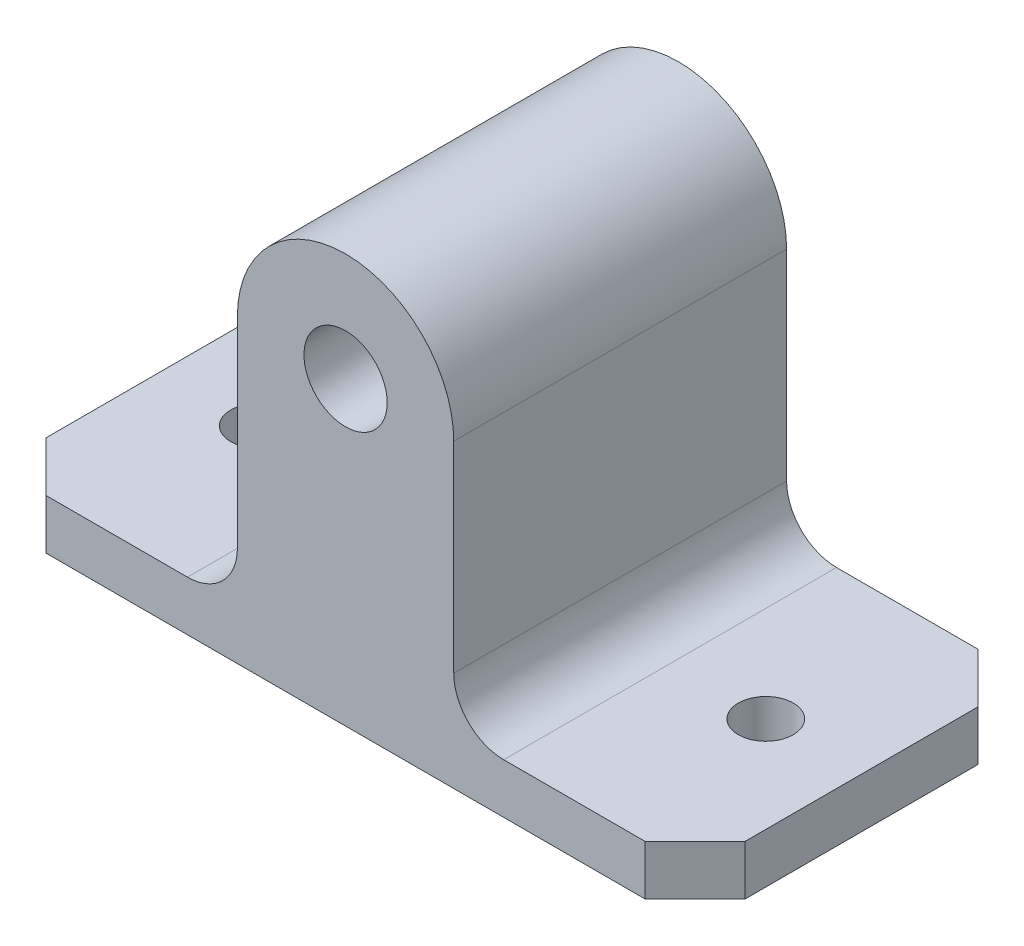
ISO-10303-21;
HEADER;
FILE_DESCRIPTION(('STEP AP214'),'2;1');
FILE_NAME('part.step','',(''),(''),'','','');
FILE_SCHEMA(('AUTOMOTIVE_DESIGN { 1 0 10303 214 1 1 1 1 }'));
ENDSEC;
DATA;
#1=APPLICATION_CONTEXT('core data for automotive mechanical design processes');
#2=APPLICATION_PROTOCOL_DEFINITION('international standard','automotive_design',2000,#1);
#3=PRODUCT_CONTEXT('',#1,'mechanical');
#4=PRODUCT('Part','Part','',(#3));
#5=PRODUCT_RELATED_PRODUCT_CATEGORY('part','',(#4));
#6=PRODUCT_DEFINITION_FORMATION('','',#4);
#7=PRODUCT_DEFINITION_CONTEXT('part definition',#1,'design');
#8=PRODUCT_DEFINITION('design','',#6,#7);
#9=PRODUCT_DEFINITION_SHAPE('','',#8);
#10=(LENGTH_UNIT() NAMED_UNIT(*) SI_UNIT(.MILLI.,.METRE.));
#11=(NAMED_UNIT(*) PLANE_ANGLE_UNIT() SI_UNIT($,.RADIAN.));
#12=(NAMED_UNIT(*) SI_UNIT($,.STERADIAN.) SOLID_ANGLE_UNIT());
#13=UNCERTAINTY_MEASURE_WITH_UNIT(LENGTH_MEASURE(1.E-05),#10,'distance_accuracy_value','');
#14=(GEOMETRIC_REPRESENTATION_CONTEXT(3) GLOBAL_UNCERTAINTY_ASSIGNED_CONTEXT((#13)) GLOBAL_UNIT_ASSIGNED_CONTEXT((#10,
#11,#12)) REPRESENTATION_CONTEXT('',''));
#15=CARTESIAN_POINT('',(0.,0.,0.));
#16=DIRECTION('',(0.,0.,1.));
#17=DIRECTION('',(1.,0.,0.));
#18=AXIS2_PLACEMENT_3D('',#15,#16,#17);
#19=CARTESIAN_POINT('',(-9.5,-12.0723673279713,20.));
#20=DIRECTION('',(0.,0.,-1.));
#21=DIRECTION('',(-1.,0.,0.));
#22=AXIS2_PLACEMENT_3D('',#19,#20,#21);
#23=PLANE('',#22);
#24=DIRECTION('',(-1.,0.,0.));
#25=VECTOR('',#24,1.);
#26=CARTESIAN_POINT('',(-21.,-15.0723673279713,20.));
#27=LINE('',#26,#25);
#28=CARTESIAN_POINT('',(-9.5,-15.0723673279713,20.));
#29=VERTEX_POINT('',#28);
#30=CARTESIAN_POINT('',(-18.,-15.0723673279713,20.));
#31=VERTEX_POINT('',#30);
#32=EDGE_CURVE('E185',#29,#31,#27,.T.);
#33=ORIENTED_EDGE('',*,*,#32,.T.);
#34=DIRECTION('',(0.,-1.,0.));
#35=VECTOR('',#34,1.);
#36=CARTESIAN_POINT('',(-18.,-12.0723673279713,20.));
#37=LINE('',#36,#35);
#38=CARTESIAN_POINT('',(-18.,-18.0723673279713,20.));
#39=VERTEX_POINT('',#38);
#40=EDGE_CURVE('E248',#31,#39,#37,.T.);
#41=ORIENTED_EDGE('',*,*,#40,.T.);
#42=DIRECTION('',(1.,0.,0.));
#43=VECTOR('',#42,1.);
#44=CARTESIAN_POINT('',(-21.,-18.0723673279713,20.));
#45=LINE('',#44,#43);
#46=CARTESIAN_POINT('',(18.,-18.0723673279713,20.));
#47=VERTEX_POINT('',#46);
#48=EDGE_CURVE('E153',#39,#47,#45,.T.);
#49=ORIENTED_EDGE('',*,*,#48,.T.);
#50=DIRECTION('',(0.,1.,0.));
#51=VECTOR('',#50,1.);
#52=CARTESIAN_POINT('',(18.,-12.0723673279713,20.));
#53=LINE('',#52,#51);
#54=CARTESIAN_POINT('',(18.,-15.0723673279713,20.));
#55=VERTEX_POINT('',#54);
#56=EDGE_CURVE('E151',#47,#55,#53,.T.);
#57=ORIENTED_EDGE('',*,*,#56,.T.);
#58=DIRECTION('',(-1.,0.,0.));
#59=VECTOR('',#58,1.);
#60=CARTESIAN_POINT('',(9.5,-15.0723673279713,20.));
#61=LINE('',#60,#59);
#62=CARTESIAN_POINT('',(9.5,-15.0723673279713,20.));
#63=VERTEX_POINT('',#62);
#64=EDGE_CURVE('E142',#55,#63,#61,.T.);
#65=ORIENTED_EDGE('',*,*,#64,.T.);
#66=CARTESIAN_POINT('',(9.5,-12.0723673279713,20.));
#67=DIRECTION('',(0.,0.,-1.));
#68=DIRECTION('',(-1.,0.,0.));
#69=AXIS2_PLACEMENT_3D('',#66,#67,#68);
#70=CIRCLE('',#69,3.);
#71=CARTESIAN_POINT('',(6.5,-12.0723673279713,20.));
#72=VERTEX_POINT('',#71);
#73=EDGE_CURVE('E147',#63,#72,#70,.T.);
#74=ORIENTED_EDGE('',*,*,#73,.T.);
#75=DIRECTION('',(0.,1.,0.));
#76=VECTOR('',#75,1.);
#77=CARTESIAN_POINT('',(6.5,0.,20.));
#78=LINE('',#77,#76);
#79=CARTESIAN_POINT('',(6.5,0.,20.));
#80=VERTEX_POINT('',#79);
#81=EDGE_CURVE('E170',#72,#80,#78,.T.);
#82=ORIENTED_EDGE('',*,*,#81,.T.);
#83=CARTESIAN_POINT('',(0.,0.,20.));
#84=DIRECTION('',(0.,0.,1.));
#85=DIRECTION('',(1.,0.,0.));
#86=AXIS2_PLACEMENT_3D('',#83,#84,#85);
#87=CIRCLE('',#86,6.5);
#88=CARTESIAN_POINT('',(-6.5,0.,20.));
#89=VERTEX_POINT('',#88);
#90=EDGE_CURVE('E173',#80,#89,#87,.T.);
#91=ORIENTED_EDGE('',*,*,#90,.T.);
#92=DIRECTION('',(0.,-1.,0.));
#93=VECTOR('',#92,1.);
#94=CARTESIAN_POINT('',(-6.5,0.,20.));
#95=LINE('',#94,#93);
#96=CARTESIAN_POINT('',(-6.5,-12.0723673279713,20.));
#97=VERTEX_POINT('',#96);
#98=EDGE_CURVE('E179',#89,#97,#95,.T.);
#99=ORIENTED_EDGE('',*,*,#98,.T.);
#100=CARTESIAN_POINT('',(-9.5,-12.0723673279713,20.));
#101=DIRECTION('',(0.,0.,-1.));
#102=DIRECTION('',(-1.,0.,0.));
#103=AXIS2_PLACEMENT_3D('',#100,#101,#102);
#104=CIRCLE('',#103,3.);
#105=EDGE_CURVE('E182',#97,#29,#104,.T.);
#106=ORIENTED_EDGE('',*,*,#105,.T.);
#107=EDGE_LOOP('',(#33,#41,#49,#57,#65,#74,#82,#91,#99,#106));
#108=FACE_BOUND('',#107,.T.);
#109=CARTESIAN_POINT('',(0.,0.,20.));
#110=DIRECTION('',(0.,0.,1.));
#111=DIRECTION('',(1.,0.,0.));
#112=AXIS2_PLACEMENT_3D('',#109,#110,#111);
#113=CIRCLE('',#112,2.5);
#114=CARTESIAN_POINT('',(2.5,0.,20.));
#115=VERTEX_POINT('',#114);
#116=EDGE_CURVE('E193',#115,#115,#113,.T.);
#117=ORIENTED_EDGE('',*,*,#116,.F.);
#118=EDGE_LOOP('',(#117));
#119=FACE_BOUND('',#118,.T.);
#120=ADVANCED_FACE('F41',(#108,#119),#23,.F.);
#121=CARTESIAN_POINT('',(-9.5,-12.0723673279713,0.));
#122=DIRECTION('',(0.,0.,-1.));
#123=DIRECTION('',(-1.,0.,0.));
#124=AXIS2_PLACEMENT_3D('',#121,#122,#123);
#125=PLANE('',#124);
#126=DIRECTION('',(1.,0.,0.));
#127=VECTOR('',#126,1.);
#128=CARTESIAN_POINT('',(-21.,-18.0723673279713,0.));
#129=LINE('',#128,#127);
#130=CARTESIAN_POINT('',(-18.,-18.0723673279713,0.));
#131=VERTEX_POINT('',#130);
#132=CARTESIAN_POINT('',(18.,-18.0723673279713,0.));
#133=VERTEX_POINT('',#132);
#134=EDGE_CURVE('E189',#131,#133,#129,.T.);
#135=ORIENTED_EDGE('',*,*,#134,.F.);
#136=DIRECTION('',(0.,1.,0.));
#137=VECTOR('',#136,1.);
#138=CARTESIAN_POINT('',(-18.,-15.0723673279713,0.));
#139=LINE('',#138,#137);
#140=CARTESIAN_POINT('',(-18.,-15.0723673279713,0.));
#141=VERTEX_POINT('',#140);
#142=EDGE_CURVE('E280',#131,#141,#139,.T.);
#143=ORIENTED_EDGE('',*,*,#142,.T.);
#144=DIRECTION('',(-1.,0.,0.));
#145=VECTOR('',#144,1.);
#146=CARTESIAN_POINT('',(-21.,-15.0723673279713,0.));
#147=LINE('',#146,#145);
#148=CARTESIAN_POINT('',(-9.5,-15.0723673279713,0.));
#149=VERTEX_POINT('',#148);
#150=EDGE_CURVE('E211',#149,#141,#147,.T.);
#151=ORIENTED_EDGE('',*,*,#150,.F.);
#152=CARTESIAN_POINT('',(-9.5,-12.0723673279713,0.));
#153=DIRECTION('',(0.,0.,-1.));
#154=DIRECTION('',(-1.,0.,0.));
#155=AXIS2_PLACEMENT_3D('',#152,#153,#154);
#156=CIRCLE('',#155,3.);
#157=CARTESIAN_POINT('',(-6.5,-12.0723673279713,0.));
#158=VERTEX_POINT('',#157);
#159=EDGE_CURVE('E208',#158,#149,#156,.T.);
#160=ORIENTED_EDGE('',*,*,#159,.F.);
#161=DIRECTION('',(0.,-1.,0.));
#162=VECTOR('',#161,1.);
#163=CARTESIAN_POINT('',(-6.5,0.,0.));
#164=LINE('',#163,#162);
#165=CARTESIAN_POINT('',(-6.5,0.,0.));
#166=VERTEX_POINT('',#165);
#167=EDGE_CURVE('E205',#166,#158,#164,.T.);
#168=ORIENTED_EDGE('',*,*,#167,.F.);
#169=CARTESIAN_POINT('',(0.,0.,0.));
#170=DIRECTION('',(0.,0.,1.));
#171=DIRECTION('',(1.,0.,0.));
#172=AXIS2_PLACEMENT_3D('',#169,#170,#171);
#173=CIRCLE('',#172,6.5);
#174=CARTESIAN_POINT('',(6.5,0.,0.));
#175=VERTEX_POINT('',#174);
#176=EDGE_CURVE('E202',#175,#166,#173,.T.);
#177=ORIENTED_EDGE('',*,*,#176,.F.);
#178=DIRECTION('',(0.,1.,0.));
#179=VECTOR('',#178,1.);
#180=CARTESIAN_POINT('',(6.5,0.,0.));
#181=LINE('',#180,#179);
#182=CARTESIAN_POINT('',(6.5,-12.0723673279713,0.));
#183=VERTEX_POINT('',#182);
#184=EDGE_CURVE('E199',#183,#175,#181,.T.);
#185=ORIENTED_EDGE('',*,*,#184,.F.);
#186=CARTESIAN_POINT('',(9.5,-12.0723673279713,0.));
#187=DIRECTION('',(0.,0.,-1.));
#188=DIRECTION('',(-1.,0.,0.));
#189=AXIS2_PLACEMENT_3D('',#186,#187,#188);
#190=CIRCLE('',#189,3.);
#191=CARTESIAN_POINT('',(9.5,-15.0723673279713,0.));
#192=VERTEX_POINT('',#191);
#193=EDGE_CURVE('E196',#192,#183,#190,.T.);
#194=ORIENTED_EDGE('',*,*,#193,.F.);
#195=DIRECTION('',(-1.,0.,0.));
#196=VECTOR('',#195,1.);
#197=CARTESIAN_POINT('',(9.5,-15.0723673279713,0.));
#198=LINE('',#197,#196);
#199=CARTESIAN_POINT('',(18.,-15.0723673279713,0.));
#200=VERTEX_POINT('',#199);
#201=EDGE_CURVE('E159',#200,#192,#198,.T.);
#202=ORIENTED_EDGE('',*,*,#201,.F.);
#203=DIRECTION('',(0.,-1.,0.));
#204=VECTOR('',#203,1.);
#205=CARTESIAN_POINT('',(18.,-18.0723673279713,0.));
#206=LINE('',#205,#204);
#207=EDGE_CURVE('E277',#200,#133,#206,.T.);
#208=ORIENTED_EDGE('',*,*,#207,.T.);
#209=EDGE_LOOP('',(#135,#143,#151,#160,#168,#177,#185,#194,#202,#208));
#210=FACE_BOUND('',#209,.T.);
#211=CARTESIAN_POINT('',(0.,0.,0.));
#212=DIRECTION('',(0.,0.,1.));
#213=DIRECTION('',(1.,0.,0.));
#214=AXIS2_PLACEMENT_3D('',#211,#212,#213);
#215=CIRCLE('',#214,2.5);
#216=CARTESIAN_POINT('',(2.5,0.,0.));
#217=VERTEX_POINT('',#216);
#218=EDGE_CURVE('E524',#217,#217,#215,.T.);
#219=ORIENTED_EDGE('',*,*,#218,.T.);
#220=EDGE_LOOP('',(#219));
#221=FACE_BOUND('',#220,.T.);
#222=ADVANCED_FACE('F296',(#210,#221),#125,.T.);
#223=CARTESIAN_POINT('',(-21.,-18.0723673279713,20.));
#224=DIRECTION('',(1.,0.,0.));
#225=DIRECTION('',(0.,0.,-1.));
#226=AXIS2_PLACEMENT_3D('',#223,#224,#225);
#227=PLANE('',#226);
#228=DIRECTION('',(0.,0.,-1.));
#229=VECTOR('',#228,1.);
#230=CARTESIAN_POINT('',(-21.,-18.0723673279713,20.));
#231=LINE('',#230,#229);
#232=CARTESIAN_POINT('',(-21.,-18.0723673279713,17.));
#233=VERTEX_POINT('',#232);
#234=CARTESIAN_POINT('',(-21.,-18.0723673279713,3.00000000000001));
#235=VERTEX_POINT('',#234);
#236=EDGE_CURVE('E242',#233,#235,#231,.T.);
#237=ORIENTED_EDGE('',*,*,#236,.F.);
#238=DIRECTION('',(0.,1.,0.));
#239=VECTOR('',#238,1.);
#240=CARTESIAN_POINT('',(-21.,-18.0723673279713,17.));
#241=LINE('',#240,#239);
#242=CARTESIAN_POINT('',(-21.,-15.0723673279713,17.));
#243=VERTEX_POINT('',#242);
#244=EDGE_CURVE('E268',#233,#243,#241,.T.);
#245=ORIENTED_EDGE('',*,*,#244,.T.);
#246=DIRECTION('',(0.,0.,-1.));
#247=VECTOR('',#246,1.);
#248=CARTESIAN_POINT('',(-21.,-15.0723673279713,20.));
#249=LINE('',#248,#247);
#250=CARTESIAN_POINT('',(-21.,-15.0723673279713,3.00000000000001));
#251=VERTEX_POINT('',#250);
#252=EDGE_CURVE('E188',#243,#251,#249,.T.);
#253=ORIENTED_EDGE('',*,*,#252,.T.);
#254=DIRECTION('',(0.,-1.,0.));
#255=VECTOR('',#254,1.);
#256=CARTESIAN_POINT('',(-21.,-18.0723673279713,3.00000000000001));
#257=LINE('',#256,#255);
#258=EDGE_CURVE('E264',#251,#235,#257,.T.);
#259=ORIENTED_EDGE('',*,*,#258,.T.);
#260=EDGE_LOOP('',(#237,#245,#253,#259));
#261=FACE_BOUND('',#260,.T.);
#262=ADVANCED_FACE('F316',(#261),#227,.F.);
#263=CARTESIAN_POINT('',(-21.,-18.0723673279713,20.));
#264=DIRECTION('',(0.,1.,0.));
#265=DIRECTION('',(-1.,0.,0.));
#266=AXIS2_PLACEMENT_3D('',#263,#264,#265);
#267=PLANE('',#266);
#268=CARTESIAN_POINT('',(15.25,-18.0723673279713,9.99999999999999));
#269=DIRECTION('',(0.,1.,0.));
#270=DIRECTION('',(-1.,0.,0.));
#271=AXIS2_PLACEMENT_3D('',#268,#269,#270);
#272=CIRCLE('',#271,1.65);
#273=CARTESIAN_POINT('',(13.6,-18.0723673279713,9.99999999999999));
#274=VERTEX_POINT('',#273);
#275=EDGE_CURVE('E514',#274,#274,#272,.T.);
#276=ORIENTED_EDGE('',*,*,#275,.T.);
#277=EDGE_LOOP('',(#276));
#278=FACE_BOUND('',#277,.T.);
#279=CARTESIAN_POINT('',(-15.25,-18.0723673279713,10.));
#280=DIRECTION('',(0.,1.,0.));
#281=DIRECTION('',(-1.,0.,0.));
#282=AXIS2_PLACEMENT_3D('',#279,#280,#281);
#283=CIRCLE('',#282,1.65);
#284=CARTESIAN_POINT('',(-16.9,-18.0723673279713,10.));
#285=VERTEX_POINT('',#284);
#286=EDGE_CURVE('E517',#285,#285,#283,.T.);
#287=ORIENTED_EDGE('',*,*,#286,.T.);
#288=EDGE_LOOP('',(#287));
#289=FACE_BOUND('',#288,.T.);
#290=ORIENTED_EDGE('',*,*,#48,.F.);
#291=DIRECTION('',(0.707106781186547,0.,0.707106781186548));
#292=VECTOR('',#291,1.);
#293=CARTESIAN_POINT('',(-18.,-18.0723673279713,20.));
#294=LINE('',#293,#292);
#295=EDGE_CURVE('E261',#39,#233,#294,.F.);
#296=ORIENTED_EDGE('',*,*,#295,.T.);
#297=ORIENTED_EDGE('',*,*,#236,.T.);
#298=DIRECTION('',(0.707106781186548,0.,-0.707106781186547));
#299=VECTOR('',#298,1.);
#300=CARTESIAN_POINT('',(-21.,-18.0723673279713,3.00000000000001));
#301=LINE('',#300,#299);
#302=EDGE_CURVE('E258',#235,#131,#301,.T.);
#303=ORIENTED_EDGE('',*,*,#302,.T.);
#304=ORIENTED_EDGE('',*,*,#134,.T.);
#305=DIRECTION('',(0.707106781186548,0.,0.707106781186547));
#306=VECTOR('',#305,1.);
#307=CARTESIAN_POINT('',(21.,-18.0723673279713,3.00000000000001));
#308=LINE('',#307,#306);
#309=CARTESIAN_POINT('',(21.,-18.0723673279713,3.00000000000001));
#310=VERTEX_POINT('',#309);
#311=EDGE_CURVE('E255',#133,#310,#308,.T.);
#312=ORIENTED_EDGE('',*,*,#311,.T.);
#313=DIRECTION('',(0.,0.,-1.));
#314=VECTOR('',#313,1.);
#315=CARTESIAN_POINT('',(21.,-18.0723673279713,20.));
#316=LINE('',#315,#314);
#317=CARTESIAN_POINT('',(21.,-18.0723673279713,17.));
#318=VERTEX_POINT('',#317);
#319=EDGE_CURVE('E238',#318,#310,#316,.T.);
#320=ORIENTED_EDGE('',*,*,#319,.F.);
#321=DIRECTION('',(0.707106781186547,0.,-0.707106781186548));
#322=VECTOR('',#321,1.);
#323=CARTESIAN_POINT('',(18.,-18.0723673279713,20.));
#324=LINE('',#323,#322);
#325=EDGE_CURVE('E252',#318,#47,#324,.F.);
#326=ORIENTED_EDGE('',*,*,#325,.T.);
#327=EDGE_LOOP('',(#290,#296,#297,#303,#304,#312,#320,#326));
#328=FACE_BOUND('',#327,.T.);
#329=ADVANCED_FACE('F302',(#278,#289,#328),#267,.F.);
#330=CARTESIAN_POINT('',(21.,-18.0723673279713,20.));
#331=DIRECTION('',(-1.,0.,0.));
#332=DIRECTION('',(0.,0.,1.));
#333=AXIS2_PLACEMENT_3D('',#330,#331,#332);
#334=PLANE('',#333);
#335=ORIENTED_EDGE('',*,*,#319,.T.);
#336=DIRECTION('',(0.,1.,0.));
#337=VECTOR('',#336,1.);
#338=CARTESIAN_POINT('',(21.,-15.0723673279713,3.00000000000001));
#339=LINE('',#338,#337);
#340=CARTESIAN_POINT('',(21.,-15.0723673279713,3.00000000000001));
#341=VERTEX_POINT('',#340);
#342=EDGE_CURVE('E286',#310,#341,#339,.T.);
#343=ORIENTED_EDGE('',*,*,#342,.T.);
#344=DIRECTION('',(0.,0.,-1.));
#345=VECTOR('',#344,1.);
#346=CARTESIAN_POINT('',(21.,-15.0723673279713,20.));
#347=LINE('',#346,#345);
#348=CARTESIAN_POINT('',(21.,-15.0723673279713,17.));
#349=VERTEX_POINT('',#348);
#350=EDGE_CURVE('E163',#349,#341,#347,.T.);
#351=ORIENTED_EDGE('',*,*,#350,.F.);
#352=DIRECTION('',(0.,-1.,0.));
#353=VECTOR('',#352,1.);
#354=CARTESIAN_POINT('',(21.,-18.0723673279713,17.));
#355=LINE('',#354,#353);
#356=EDGE_CURVE('E283',#349,#318,#355,.T.);
#357=ORIENTED_EDGE('',*,*,#356,.T.);
#358=EDGE_LOOP('',(#335,#343,#351,#357));
#359=FACE_BOUND('',#358,.T.);
#360=ADVANCED_FACE('F290',(#359),#334,.F.);
#361=CARTESIAN_POINT('',(9.5,-15.0723673279713,20.));
#362=DIRECTION('',(0.,-1.,0.));
#363=DIRECTION('',(1.,0.,0.));
#364=AXIS2_PLACEMENT_3D('',#361,#362,#363);
#365=PLANE('',#364);
#366=CARTESIAN_POINT('',(15.25,-15.0723673279713,9.99999999999999));
#367=DIRECTION('',(0.,1.,0.));
#368=DIRECTION('',(-1.,0.,0.));
#369=AXIS2_PLACEMENT_3D('',#366,#367,#368);
#370=CIRCLE('',#369,1.65);
#371=CARTESIAN_POINT('',(13.6,-15.0723673279713,9.99999999999999));
#372=VERTEX_POINT('',#371);
#373=EDGE_CURVE('E520',#372,#372,#370,.T.);
#374=ORIENTED_EDGE('',*,*,#373,.F.);
#375=EDGE_LOOP('',(#374));
#376=FACE_BOUND('',#375,.T.);
#377=ORIENTED_EDGE('',*,*,#350,.T.);
#378=DIRECTION('',(-0.707106781186548,0.,-0.707106781186547));
#379=VECTOR('',#378,1.);
#380=CARTESIAN_POINT('',(21.,-15.0723673279713,3.00000000000001));
#381=LINE('',#380,#379);
#382=EDGE_CURVE('E11',#341,#200,#381,.T.);
#383=ORIENTED_EDGE('',*,*,#382,.T.);
#384=ORIENTED_EDGE('',*,*,#201,.T.);
#385=DIRECTION('',(0.,0.,-1.));
#386=VECTOR('',#385,1.);
#387=CARTESIAN_POINT('',(9.5,-15.0723673279713,20.));
#388=LINE('',#387,#386);
#389=EDGE_CURVE('E156',#63,#192,#388,.T.);
#390=ORIENTED_EDGE('',*,*,#389,.F.);
#391=ORIENTED_EDGE('',*,*,#64,.F.);
#392=DIRECTION('',(-0.707106781186547,0.,0.707106781186548));
#393=VECTOR('',#392,1.);
#394=CARTESIAN_POINT('',(18.,-15.0723673279713,20.));
#395=LINE('',#394,#393);
#396=EDGE_CURVE('E51',#55,#349,#395,.F.);
#397=ORIENTED_EDGE('',*,*,#396,.T.);
#398=EDGE_LOOP('',(#377,#383,#384,#390,#391,#397));
#399=FACE_BOUND('',#398,.T.);
#400=ADVANCED_FACE('F157',(#376,#399),#365,.F.);
#401=CARTESIAN_POINT('',(9.5,-12.0723673279713,20.));
#402=DIRECTION('',(0.,0.,-1.));
#403=DIRECTION('',(-1.,0.,0.));
#404=AXIS2_PLACEMENT_3D('',#401,#402,#403);
#405=CYLINDRICAL_SURFACE('',#404,3.);
#406=ORIENTED_EDGE('',*,*,#193,.T.);
#407=DIRECTION('',(0.,0.,-1.));
#408=VECTOR('',#407,1.);
#409=CARTESIAN_POINT('',(6.5,-12.0723673279713,20.));
#410=LINE('',#409,#408);
#411=EDGE_CURVE('E164',#72,#183,#410,.T.);
#412=ORIENTED_EDGE('',*,*,#411,.F.);
#413=ORIENTED_EDGE('',*,*,#73,.F.);
#414=ORIENTED_EDGE('',*,*,#389,.T.);
#415=EDGE_LOOP('',(#406,#412,#413,#414));
#416=FACE_BOUND('',#415,.T.);
#417=ADVANCED_FACE('F166',(#416),#405,.F.);
#418=CARTESIAN_POINT('',(6.5,0.,20.));
#419=DIRECTION('',(-1.,0.,0.));
#420=DIRECTION('',(0.,-1.,0.));
#421=AXIS2_PLACEMENT_3D('',#418,#419,#420);
#422=PLANE('',#421);
#423=ORIENTED_EDGE('',*,*,#184,.T.);
#424=DIRECTION('',(0.,0.,-1.));
#425=VECTOR('',#424,1.);
#426=CARTESIAN_POINT('',(6.5,0.,20.));
#427=LINE('',#426,#425);
#428=EDGE_CURVE('E230',#80,#175,#427,.T.);
#429=ORIENTED_EDGE('',*,*,#428,.F.);
#430=ORIENTED_EDGE('',*,*,#81,.F.);
#431=ORIENTED_EDGE('',*,*,#411,.T.);
#432=EDGE_LOOP('',(#423,#429,#430,#431));
#433=FACE_BOUND('',#432,.T.);
#434=ADVANCED_FACE('F339',(#433),#422,.F.);
#435=CARTESIAN_POINT('',(0.,0.,20.));
#436=DIRECTION('',(0.,0.,-1.));
#437=DIRECTION('',(-1.,0.,0.));
#438=AXIS2_PLACEMENT_3D('',#435,#436,#437);
#439=CYLINDRICAL_SURFACE('',#438,6.5);
#440=ORIENTED_EDGE('',*,*,#176,.T.);
#441=DIRECTION('',(0.,0.,-1.));
#442=VECTOR('',#441,1.);
#443=CARTESIAN_POINT('',(-6.5,0.,20.));
#444=LINE('',#443,#442);
#445=EDGE_CURVE('E226',#89,#166,#444,.T.);
#446=ORIENTED_EDGE('',*,*,#445,.F.);
#447=ORIENTED_EDGE('',*,*,#90,.F.);
#448=ORIENTED_EDGE('',*,*,#428,.T.);
#449=EDGE_LOOP('',(#440,#446,#447,#448));
#450=FACE_BOUND('',#449,.T.);
#451=ADVANCED_FACE('F336',(#450),#439,.T.);
#452=CARTESIAN_POINT('',(-6.5,0.,20.));
#453=DIRECTION('',(1.,0.,0.));
#454=DIRECTION('',(0.,1.,0.));
#455=AXIS2_PLACEMENT_3D('',#452,#453,#454);
#456=PLANE('',#455);
#457=ORIENTED_EDGE('',*,*,#167,.T.);
#458=DIRECTION('',(0.,0.,-1.));
#459=VECTOR('',#458,1.);
#460=CARTESIAN_POINT('',(-6.5,-12.0723673279713,20.));
#461=LINE('',#460,#459);
#462=EDGE_CURVE('E222',#97,#158,#461,.T.);
#463=ORIENTED_EDGE('',*,*,#462,.F.);
#464=ORIENTED_EDGE('',*,*,#98,.F.);
#465=ORIENTED_EDGE('',*,*,#445,.T.);
#466=EDGE_LOOP('',(#457,#463,#464,#465));
#467=FACE_BOUND('',#466,.T.);
#468=ADVANCED_FACE('F332',(#467),#456,.F.);
#469=CARTESIAN_POINT('',(-9.5,-12.0723673279713,20.));
#470=DIRECTION('',(0.,0.,-1.));
#471=DIRECTION('',(-1.,0.,0.));
#472=AXIS2_PLACEMENT_3D('',#469,#470,#471);
#473=CYLINDRICAL_SURFACE('',#472,3.);
#474=ORIENTED_EDGE('',*,*,#159,.T.);
#475=DIRECTION('',(0.,0.,-1.));
#476=VECTOR('',#475,1.);
#477=CARTESIAN_POINT('',(-9.5,-15.0723673279713,20.));
#478=LINE('',#477,#476);
#479=EDGE_CURVE('E218',#29,#149,#478,.T.);
#480=ORIENTED_EDGE('',*,*,#479,.F.);
#481=ORIENTED_EDGE('',*,*,#105,.F.);
#482=ORIENTED_EDGE('',*,*,#462,.T.);
#483=EDGE_LOOP('',(#474,#480,#481,#482));
#484=FACE_BOUND('',#483,.T.);
#485=ADVANCED_FACE('F327',(#484),#473,.F.);
#486=CARTESIAN_POINT('',(-21.,-15.0723673279713,20.));
#487=DIRECTION('',(0.,-1.,0.));
#488=DIRECTION('',(0.,0.,-1.));
#489=AXIS2_PLACEMENT_3D('',#486,#487,#488);
#490=PLANE('',#489);
#491=CARTESIAN_POINT('',(-15.25,-15.0723673279713,10.));
#492=DIRECTION('',(0.,1.,0.));
#493=DIRECTION('',(-1.,0.,0.));
#494=AXIS2_PLACEMENT_3D('',#491,#492,#493);
#495=CIRCLE('',#494,1.65);
#496=CARTESIAN_POINT('',(-16.9,-15.0723673279713,10.));
#497=VERTEX_POINT('',#496);
#498=EDGE_CURVE('E527',#497,#497,#495,.T.);
#499=ORIENTED_EDGE('',*,*,#498,.F.);
#500=EDGE_LOOP('',(#499));
#501=FACE_BOUND('',#500,.T.);
#502=ORIENTED_EDGE('',*,*,#252,.F.);
#503=DIRECTION('',(-0.707106781186547,0.,-0.707106781186548));
#504=VECTOR('',#503,1.);
#505=CARTESIAN_POINT('',(-18.,-15.0723673279713,20.));
#506=LINE('',#505,#504);
#507=EDGE_CURVE('E274',#243,#31,#506,.F.);
#508=ORIENTED_EDGE('',*,*,#507,.T.);
#509=ORIENTED_EDGE('',*,*,#32,.F.);
#510=ORIENTED_EDGE('',*,*,#479,.T.);
#511=ORIENTED_EDGE('',*,*,#150,.T.);
#512=DIRECTION('',(-0.707106781186548,0.,0.707106781186547));
#513=VECTOR('',#512,1.);
#514=CARTESIAN_POINT('',(-21.,-15.0723673279713,3.00000000000001));
#515=LINE('',#514,#513);
#516=EDGE_CURVE('E271',#141,#251,#515,.T.);
#517=ORIENTED_EDGE('',*,*,#516,.T.);
#518=EDGE_LOOP('',(#502,#508,#509,#510,#511,#517));
#519=FACE_BOUND('',#518,.T.);
#520=ADVANCED_FACE('F312',(#501,#519),#490,.F.);
#521=CARTESIAN_POINT('',(0.,0.,20.));
#522=DIRECTION('',(0.,0.,-1.));
#523=DIRECTION('',(-1.,0.,0.));
#524=AXIS2_PLACEMENT_3D('',#521,#522,#523);
#525=CYLINDRICAL_SURFACE('',#524,2.5);
#526=ORIENTED_EDGE('',*,*,#116,.T.);
#527=EDGE_LOOP('',(#526));
#528=FACE_BOUND('',#527,.T.);
#529=ORIENTED_EDGE('',*,*,#218,.F.);
#530=EDGE_LOOP('',(#529));
#531=FACE_BOUND('',#530,.T.);
#532=ADVANCED_FACE('F355',(#528,#531),#525,.F.);
#533=CARTESIAN_POINT('',(-18.,-12.0723673279713,20.));
#534=DIRECTION('',(0.707106781186548,0.,-0.707106781186547));
#535=DIRECTION('',(0.,-1.,0.));
#536=AXIS2_PLACEMENT_3D('',#533,#534,#535);
#537=PLANE('',#536);
#538=ORIENTED_EDGE('',*,*,#507,.F.);
#539=ORIENTED_EDGE('',*,*,#244,.F.);
#540=ORIENTED_EDGE('',*,*,#295,.F.);
#541=ORIENTED_EDGE('',*,*,#40,.F.);
#542=EDGE_LOOP('',(#538,#539,#540,#541));
#543=FACE_BOUND('',#542,.T.);
#544=ADVANCED_FACE('F319',(#543),#537,.F.);
#545=CARTESIAN_POINT('',(-21.,-18.0723673279713,3.00000000000001));
#546=DIRECTION('',(-0.707106781186547,0.,-0.707106781186548));
#547=DIRECTION('',(0.,1.,0.));
#548=AXIS2_PLACEMENT_3D('',#545,#546,#547);
#549=PLANE('',#548);
#550=ORIENTED_EDGE('',*,*,#516,.F.);
#551=ORIENTED_EDGE('',*,*,#142,.F.);
#552=ORIENTED_EDGE('',*,*,#302,.F.);
#553=ORIENTED_EDGE('',*,*,#258,.F.);
#554=EDGE_LOOP('',(#550,#551,#552,#553));
#555=FACE_BOUND('',#554,.T.);
#556=ADVANCED_FACE('F308',(#555),#549,.T.);
#557=CARTESIAN_POINT('',(21.,-18.0723673279713,3.00000000000001));
#558=DIRECTION('',(0.707106781186547,0.,-0.707106781186548));
#559=DIRECTION('',(0.,-1.,0.));
#560=AXIS2_PLACEMENT_3D('',#557,#558,#559);
#561=PLANE('',#560);
#562=ORIENTED_EDGE('',*,*,#311,.F.);
#563=ORIENTED_EDGE('',*,*,#207,.F.);
#564=ORIENTED_EDGE('',*,*,#382,.F.);
#565=ORIENTED_EDGE('',*,*,#342,.F.);
#566=EDGE_LOOP('',(#562,#563,#564,#565));
#567=FACE_BOUND('',#566,.T.);
#568=ADVANCED_FACE('F299',(#567),#561,.T.);
#569=CARTESIAN_POINT('',(18.,-12.0723673279713,20.));
#570=DIRECTION('',(-0.707106781186548,0.,-0.707106781186547));
#571=DIRECTION('',(0.,1.,0.));
#572=AXIS2_PLACEMENT_3D('',#569,#570,#571);
#573=PLANE('',#572);
#574=ORIENTED_EDGE('',*,*,#325,.F.);
#575=ORIENTED_EDGE('',*,*,#356,.F.);
#576=ORIENTED_EDGE('',*,*,#396,.F.);
#577=ORIENTED_EDGE('',*,*,#56,.F.);
#578=EDGE_LOOP('',(#574,#575,#576,#577));
#579=FACE_BOUND('',#578,.T.);
#580=ADVANCED_FACE('F44',(#579),#573,.F.);
#581=CARTESIAN_POINT('',(-15.25,-35.0723673279713,10.));
#582=DIRECTION('',(0.,1.,0.));
#583=DIRECTION('',(-1.,0.,0.));
#584=AXIS2_PLACEMENT_3D('',#581,#582,#583);
#585=CYLINDRICAL_SURFACE('',#584,1.65);
#586=ORIENTED_EDGE('',*,*,#498,.T.);
#587=EDGE_LOOP('',(#586));
#588=FACE_BOUND('',#587,.T.);
#589=ORIENTED_EDGE('',*,*,#286,.F.);
#590=EDGE_LOOP('',(#589));
#591=FACE_BOUND('',#590,.T.);
#592=ADVANCED_FACE('F408',(#588,#591),#585,.F.);
#593=CARTESIAN_POINT('',(15.25,-35.0723673279713,9.99999999999999));
#594=DIRECTION('',(0.,1.,0.));
#595=DIRECTION('',(-1.,0.,0.));
#596=AXIS2_PLACEMENT_3D('',#593,#594,#595);
#597=CYLINDRICAL_SURFACE('',#596,1.65);
#598=ORIENTED_EDGE('',*,*,#373,.T.);
#599=EDGE_LOOP('',(#598));
#600=FACE_BOUND('',#599,.T.);
#601=ORIENTED_EDGE('',*,*,#275,.F.);
#602=EDGE_LOOP('',(#601));
#603=FACE_BOUND('',#602,.T.);
#604=ADVANCED_FACE('F415',(#600,#603),#597,.F.);
#605=CLOSED_SHELL('',(#120,#222,#262,#329,#360,#400,#417,#434,#451,#468,#485,#520,#532,#544,
#556,#568,#580,#592,#604));
#606=MANIFOLD_SOLID_BREP('B2',#605);
#607=ADVANCED_BREP_SHAPE_REPRESENTATION('',(#18,#606),#14);
#608=SHAPE_DEFINITION_REPRESENTATION(#9,#607);
ENDSEC;
END-ISO-10303-21;
